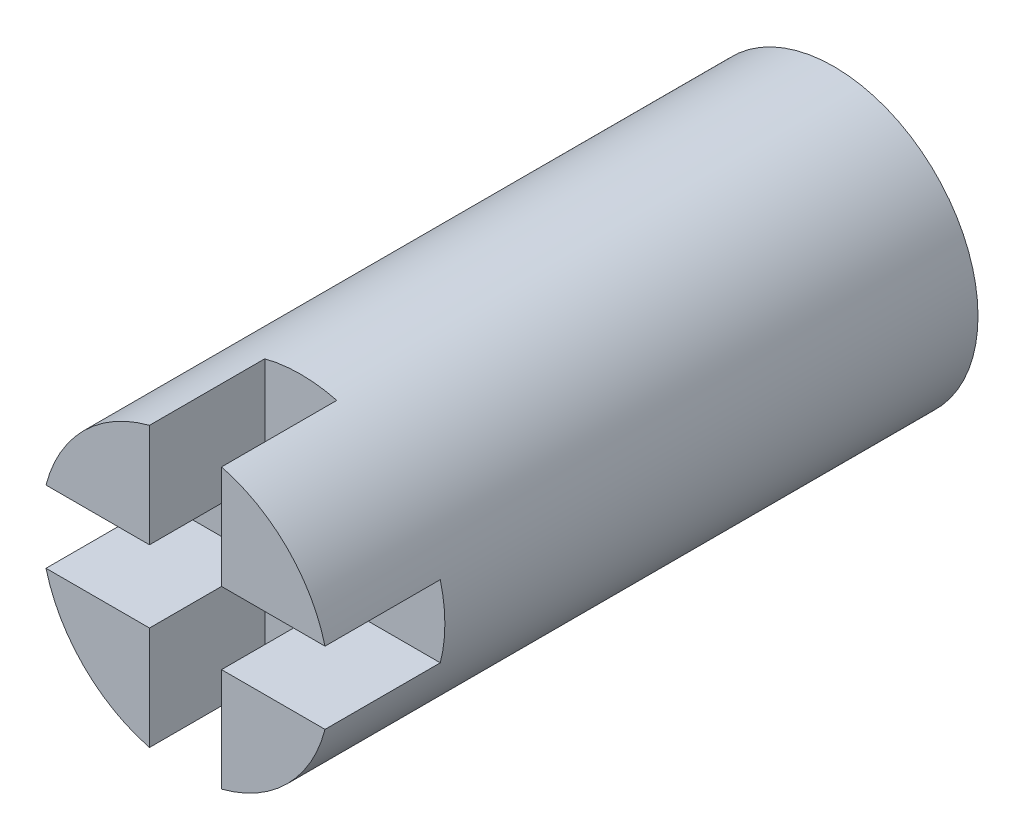
ISO-10303-21;
HEADER;
FILE_DESCRIPTION(('STEP AP214'),'2;1');
FILE_NAME('part.step','',(''),(''),'','','');
FILE_SCHEMA(('AUTOMOTIVE_DESIGN { 1 0 10303 214 1 1 1 1 }'));
ENDSEC;
DATA;
#1=APPLICATION_CONTEXT('core data for automotive mechanical design processes');
#2=APPLICATION_PROTOCOL_DEFINITION('international standard','automotive_design',2000,#1);
#3=PRODUCT_CONTEXT('',#1,'mechanical');
#4=PRODUCT('Part','Part','',(#3));
#5=PRODUCT_RELATED_PRODUCT_CATEGORY('part','',(#4));
#6=PRODUCT_DEFINITION_FORMATION('','',#4);
#7=PRODUCT_DEFINITION_CONTEXT('part definition',#1,'design');
#8=PRODUCT_DEFINITION('design','',#6,#7);
#9=PRODUCT_DEFINITION_SHAPE('','',#8);
#10=(LENGTH_UNIT() NAMED_UNIT(*) SI_UNIT(.MILLI.,.METRE.));
#11=(NAMED_UNIT(*) PLANE_ANGLE_UNIT() SI_UNIT($,.RADIAN.));
#12=(NAMED_UNIT(*) SI_UNIT($,.STERADIAN.) SOLID_ANGLE_UNIT());
#13=UNCERTAINTY_MEASURE_WITH_UNIT(LENGTH_MEASURE(1.E-05),#10,'distance_accuracy_value','');
#14=(GEOMETRIC_REPRESENTATION_CONTEXT(3) GLOBAL_UNCERTAINTY_ASSIGNED_CONTEXT((#13)) GLOBAL_UNIT_ASSIGNED_CONTEXT((#10,
#11,#12)) REPRESENTATION_CONTEXT('',''));
#15=CARTESIAN_POINT('',(0.,0.,0.));
#16=DIRECTION('',(0.,0.,1.));
#17=DIRECTION('',(1.,0.,0.));
#18=AXIS2_PLACEMENT_3D('',#15,#16,#17);
#19=CARTESIAN_POINT('',(0.,0.,28.575));
#20=DIRECTION('',(0.,0.,-1.));
#21=DIRECTION('',(-1.,0.,0.));
#22=AXIS2_PLACEMENT_3D('',#19,#20,#21);
#23=CYLINDRICAL_SURFACE('',#22,6.35);
#24=CARTESIAN_POINT('',(0.,0.,0.));
#25=DIRECTION('',(0.,0.,1.));
#26=DIRECTION('',(1.,0.,0.));
#27=AXIS2_PLACEMENT_3D('',#24,#25,#26);
#28=CIRCLE('',#27,6.35);
#29=CARTESIAN_POINT('',(6.35,0.,0.));
#30=VERTEX_POINT('',#29);
#31=EDGE_CURVE('E42',#30,#30,#28,.T.);
#32=ORIENTED_EDGE('',*,*,#31,.T.);
#33=EDGE_LOOP('',(#32));
#34=FACE_BOUND('',#33,.T.);
#35=DIRECTION('',(0.,0.,1.));
#36=VECTOR('',#35,1.);
#37=CARTESIAN_POINT('',(-1.5875,6.14836106210427,23.495));
#38=LINE('',#37,#36);
#39=CARTESIAN_POINT('',(-1.5875,6.14836106210427,23.495));
#40=VERTEX_POINT('',#39);
#41=CARTESIAN_POINT('',(-1.5875,6.14836106210427,28.575));
#42=VERTEX_POINT('',#41);
#43=EDGE_CURVE('E101',#40,#42,#38,.T.);
#44=ORIENTED_EDGE('',*,*,#43,.F.);
#45=CARTESIAN_POINT('',(0.,0.,23.495));
#46=DIRECTION('',(0.,0.,1.));
#47=DIRECTION('',(1.,0.,0.));
#48=AXIS2_PLACEMENT_3D('',#45,#46,#47);
#49=CIRCLE('',#48,6.35);
#50=CARTESIAN_POINT('',(1.5875,6.14836106210428,23.495));
#51=VERTEX_POINT('',#50);
#52=EDGE_CURVE('E162',#51,#40,#49,.T.);
#53=ORIENTED_EDGE('',*,*,#52,.F.);
#54=DIRECTION('',(0.,0.,1.));
#55=VECTOR('',#54,1.);
#56=CARTESIAN_POINT('',(1.5875,6.14836106210428,23.495));
#57=LINE('',#56,#55);
#58=CARTESIAN_POINT('',(1.5875,6.14836106210428,28.575));
#59=VERTEX_POINT('',#58);
#60=EDGE_CURVE('E145',#51,#59,#57,.T.);
#61=ORIENTED_EDGE('',*,*,#60,.T.);
#62=CARTESIAN_POINT('',(0.,0.,28.575));
#63=DIRECTION('',(0.,0.,1.));
#64=DIRECTION('',(1.,0.,0.));
#65=AXIS2_PLACEMENT_3D('',#62,#63,#64);
#66=CIRCLE('',#65,6.35);
#67=CARTESIAN_POINT('',(6.14836106210427,1.5875,28.575));
#68=VERTEX_POINT('',#67);
#69=EDGE_CURVE('E11',#68,#59,#66,.T.);
#70=ORIENTED_EDGE('',*,*,#69,.F.);
#71=DIRECTION('',(0.,0.,1.));
#72=VECTOR('',#71,1.);
#73=CARTESIAN_POINT('',(6.14836106210427,1.5875,23.495));
#74=LINE('',#73,#72);
#75=CARTESIAN_POINT('',(6.14836106210427,1.5875,23.495));
#76=VERTEX_POINT('',#75);
#77=EDGE_CURVE('E146',#76,#68,#74,.T.);
#78=ORIENTED_EDGE('',*,*,#77,.F.);
#79=CARTESIAN_POINT('',(0.,0.,23.495));
#80=DIRECTION('',(0.,0.,1.));
#81=DIRECTION('',(1.,0.,0.));
#82=AXIS2_PLACEMENT_3D('',#79,#80,#81);
#83=CIRCLE('',#82,6.35);
#84=CARTESIAN_POINT('',(6.14836106210428,-1.5875,23.495));
#85=VERTEX_POINT('',#84);
#86=EDGE_CURVE('E155',#85,#76,#83,.T.);
#87=ORIENTED_EDGE('',*,*,#86,.F.);
#88=DIRECTION('',(0.,0.,1.));
#89=VECTOR('',#88,1.);
#90=CARTESIAN_POINT('',(6.14836106210428,-1.5875,23.495));
#91=LINE('',#90,#89);
#92=CARTESIAN_POINT('',(6.14836106210428,-1.5875,28.575));
#93=VERTEX_POINT('',#92);
#94=EDGE_CURVE('E202',#85,#93,#91,.T.);
#95=ORIENTED_EDGE('',*,*,#94,.T.);
#96=CARTESIAN_POINT('',(1.5875,-6.14836106210428,28.575));
#97=VERTEX_POINT('',#96);
#98=EDGE_CURVE('E49',#97,#93,#66,.T.);
#99=ORIENTED_EDGE('',*,*,#98,.F.);
#100=DIRECTION('',(0.,0.,1.));
#101=VECTOR('',#100,1.);
#102=CARTESIAN_POINT('',(1.5875,-6.14836106210428,23.495));
#103=LINE('',#102,#101);
#104=CARTESIAN_POINT('',(1.5875,-6.14836106210428,23.495));
#105=VERTEX_POINT('',#104);
#106=EDGE_CURVE('E209',#105,#97,#103,.T.);
#107=ORIENTED_EDGE('',*,*,#106,.F.);
#108=CARTESIAN_POINT('',(0.,0.,23.495));
#109=DIRECTION('',(0.,0.,1.));
#110=DIRECTION('',(1.,0.,0.));
#111=AXIS2_PLACEMENT_3D('',#108,#109,#110);
#112=CIRCLE('',#111,6.35);
#113=CARTESIAN_POINT('',(-1.5875,-6.14836106210427,23.495));
#114=VERTEX_POINT('',#113);
#115=EDGE_CURVE('E283',#114,#105,#112,.T.);
#116=ORIENTED_EDGE('',*,*,#115,.F.);
#117=DIRECTION('',(0.,0.,1.));
#118=VECTOR('',#117,1.);
#119=CARTESIAN_POINT('',(-1.5875,-6.14836106210427,23.495));
#120=LINE('',#119,#118);
#121=CARTESIAN_POINT('',(-1.5875,-6.14836106210427,28.575));
#122=VERTEX_POINT('',#121);
#123=EDGE_CURVE('E212',#114,#122,#120,.T.);
#124=ORIENTED_EDGE('',*,*,#123,.T.);
#125=CARTESIAN_POINT('',(-6.14836106210428,-1.5875,28.575));
#126=VERTEX_POINT('',#125);
#127=EDGE_CURVE('E248',#126,#122,#66,.T.);
#128=ORIENTED_EDGE('',*,*,#127,.F.);
#129=DIRECTION('',(0.,0.,1.));
#130=VECTOR('',#129,1.);
#131=CARTESIAN_POINT('',(-6.14836106210428,-1.5875,23.495));
#132=LINE('',#131,#130);
#133=CARTESIAN_POINT('',(-6.14836106210428,-1.5875,23.495));
#134=VERTEX_POINT('',#133);
#135=EDGE_CURVE('E219',#134,#126,#132,.T.);
#136=ORIENTED_EDGE('',*,*,#135,.F.);
#137=CARTESIAN_POINT('',(0.,0.,23.495));
#138=DIRECTION('',(0.,0.,1.));
#139=DIRECTION('',(1.,0.,0.));
#140=AXIS2_PLACEMENT_3D('',#137,#138,#139);
#141=CIRCLE('',#140,6.35);
#142=CARTESIAN_POINT('',(-6.14836106210427,1.5875,23.495));
#143=VERTEX_POINT('',#142);
#144=EDGE_CURVE('E267',#143,#134,#141,.T.);
#145=ORIENTED_EDGE('',*,*,#144,.F.);
#146=DIRECTION('',(0.,0.,1.));
#147=VECTOR('',#146,1.);
#148=CARTESIAN_POINT('',(-6.14836106210427,1.5875,23.495));
#149=LINE('',#148,#147);
#150=CARTESIAN_POINT('',(-6.14836106210427,1.5875,28.575));
#151=VERTEX_POINT('',#150);
#152=EDGE_CURVE('E222',#143,#151,#149,.T.);
#153=ORIENTED_EDGE('',*,*,#152,.T.);
#154=EDGE_CURVE('E48',#42,#151,#66,.T.);
#155=ORIENTED_EDGE('',*,*,#154,.F.);
#156=EDGE_LOOP('',(#44,#53,#61,#70,#78,#87,#95,#99,#107,#116,#124,#128,#136,#145,#153,#155));
#157=FACE_BOUND('',#156,.T.);
#158=ADVANCED_FACE('F39',(#34,#157),#23,.T.);
#159=CARTESIAN_POINT('',(0.,0.,28.575));
#160=DIRECTION('',(0.,0.,1.));
#161=DIRECTION('',(1.,0.,0.));
#162=AXIS2_PLACEMENT_3D('',#159,#160,#161);
#163=PLANE('',#162);
#164=DIRECTION('',(0.,1.,0.));
#165=VECTOR('',#164,1.);
#166=CARTESIAN_POINT('',(1.5875,0.,28.575));
#167=LINE('',#166,#165);
#168=CARTESIAN_POINT('',(1.5875,1.5875,28.575));
#169=VERTEX_POINT('',#168);
#170=EDGE_CURVE('E192',#169,#59,#167,.T.);
#171=ORIENTED_EDGE('',*,*,#170,.F.);
#172=DIRECTION('',(1.,0.,0.));
#173=VECTOR('',#172,1.);
#174=CARTESIAN_POINT('',(0.,1.5875,28.575));
#175=LINE('',#174,#173);
#176=EDGE_CURVE('E140',#169,#68,#175,.T.);
#177=ORIENTED_EDGE('',*,*,#176,.T.);
#178=ORIENTED_EDGE('',*,*,#69,.T.);
#179=EDGE_LOOP('',(#171,#177,#178));
#180=FACE_BOUND('',#179,.T.);
#181=ADVANCED_FACE('F298',(#180),#163,.T.);
#182=ORIENTED_EDGE('',*,*,#127,.T.);
#183=DIRECTION('',(0.,1.,0.));
#184=VECTOR('',#183,1.);
#185=CARTESIAN_POINT('',(-1.5875,0.,28.575));
#186=LINE('',#185,#184);
#187=CARTESIAN_POINT('',(-1.5875,-1.5875,28.575));
#188=VERTEX_POINT('',#187);
#189=EDGE_CURVE('E179',#122,#188,#186,.T.);
#190=ORIENTED_EDGE('',*,*,#189,.T.);
#191=DIRECTION('',(1.,0.,0.));
#192=VECTOR('',#191,1.);
#193=CARTESIAN_POINT('',(0.,-1.5875,28.575));
#194=LINE('',#193,#192);
#195=EDGE_CURVE('E175',#126,#188,#194,.T.);
#196=ORIENTED_EDGE('',*,*,#195,.F.);
#197=EDGE_LOOP('',(#182,#190,#196));
#198=FACE_BOUND('',#197,.T.);
#199=ADVANCED_FACE('F300',(#198),#163,.T.);
#200=DIRECTION('',(1.,0.,0.));
#201=VECTOR('',#200,1.);
#202=CARTESIAN_POINT('',(0.,1.5875,28.575));
#203=LINE('',#202,#201);
#204=CARTESIAN_POINT('',(-1.5875,1.5875,28.575));
#205=VERTEX_POINT('',#204);
#206=EDGE_CURVE('E171',#151,#205,#203,.T.);
#207=ORIENTED_EDGE('',*,*,#206,.T.);
#208=DIRECTION('',(0.,1.,0.));
#209=VECTOR('',#208,1.);
#210=CARTESIAN_POINT('',(-1.5875,0.,28.575));
#211=LINE('',#210,#209);
#212=EDGE_CURVE('E56',#205,#42,#211,.T.);
#213=ORIENTED_EDGE('',*,*,#212,.T.);
#214=ORIENTED_EDGE('',*,*,#154,.T.);
#215=EDGE_LOOP('',(#207,#213,#214));
#216=FACE_BOUND('',#215,.T.);
#217=ADVANCED_FACE('F262',(#216),#163,.T.);
#218=DIRECTION('',(1.,0.,0.));
#219=VECTOR('',#218,1.);
#220=CARTESIAN_POINT('',(0.,-1.5875,28.575));
#221=LINE('',#220,#219);
#222=CARTESIAN_POINT('',(1.5875,-1.5875,28.575));
#223=VERTEX_POINT('',#222);
#224=EDGE_CURVE('E187',#223,#93,#221,.T.);
#225=ORIENTED_EDGE('',*,*,#224,.F.);
#226=DIRECTION('',(0.,1.,0.));
#227=VECTOR('',#226,1.);
#228=CARTESIAN_POINT('',(1.5875,0.,28.575));
#229=LINE('',#228,#227);
#230=EDGE_CURVE('E183',#97,#223,#229,.T.);
#231=ORIENTED_EDGE('',*,*,#230,.F.);
#232=ORIENTED_EDGE('',*,*,#98,.T.);
#233=EDGE_LOOP('',(#225,#231,#232));
#234=FACE_BOUND('',#233,.T.);
#235=ADVANCED_FACE('F241',(#234),#163,.T.);
#236=CARTESIAN_POINT('',(0.,0.,0.));
#237=DIRECTION('',(0.,0.,1.));
#238=DIRECTION('',(1.,0.,0.));
#239=AXIS2_PLACEMENT_3D('',#236,#237,#238);
#240=PLANE('',#239);
#241=CARTESIAN_POINT('',(0.,0.,0.));
#242=DIRECTION('',(0.,0.,-1.));
#243=DIRECTION('',(-1.,0.,0.));
#244=AXIS2_PLACEMENT_3D('',#241,#242,#243);
#245=CIRCLE('',#244,2.9464);
#246=CARTESIAN_POINT('',(-2.9464,0.,0.));
#247=VERTEX_POINT('',#246);
#248=EDGE_CURVE('E197',#247,#247,#245,.T.);
#249=ORIENTED_EDGE('',*,*,#248,.F.);
#250=EDGE_LOOP('',(#249));
#251=FACE_BOUND('',#250,.T.);
#252=ORIENTED_EDGE('',*,*,#31,.F.);
#253=EDGE_LOOP('',(#252));
#254=FACE_BOUND('',#253,.T.);
#255=ADVANCED_FACE('F238',(#251,#254),#240,.F.);
#256=CARTESIAN_POINT('',(0.,0.,12.7));
#257=DIRECTION('',(0.,0.,-1.));
#258=DIRECTION('',(-1.,0.,0.));
#259=AXIS2_PLACEMENT_3D('',#256,#257,#258);
#260=CYLINDRICAL_SURFACE('',#259,2.9464);
#261=CARTESIAN_POINT('',(0.,0.,12.7));
#262=DIRECTION('',(0.,0.,-1.));
#263=DIRECTION('',(-1.,0.,0.));
#264=AXIS2_PLACEMENT_3D('',#261,#262,#263);
#265=CIRCLE('',#264,2.9464);
#266=CARTESIAN_POINT('',(-2.9464,0.,12.7));
#267=VERTEX_POINT('',#266);
#268=EDGE_CURVE('E228',#267,#267,#265,.T.);
#269=ORIENTED_EDGE('',*,*,#268,.F.);
#270=EDGE_LOOP('',(#269));
#271=FACE_BOUND('',#270,.T.);
#272=ORIENTED_EDGE('',*,*,#248,.T.);
#273=EDGE_LOOP('',(#272));
#274=FACE_BOUND('',#273,.T.);
#275=ADVANCED_FACE('F236',(#271,#274),#260,.F.);
#276=CARTESIAN_POINT('',(0.,0.,12.7));
#277=DIRECTION('',(0.,0.,-1.));
#278=DIRECTION('',(-1.,0.,0.));
#279=AXIS2_PLACEMENT_3D('',#276,#277,#278);
#280=PLANE('',#279);
#281=ORIENTED_EDGE('',*,*,#268,.T.);
#282=EDGE_LOOP('',(#281));
#283=FACE_BOUND('',#282,.T.);
#284=ADVANCED_FACE('F335',(#283),#280,.T.);
#285=CARTESIAN_POINT('',(-1.5875,0.,23.495));
#286=DIRECTION('',(1.,0.,0.));
#287=DIRECTION('',(0.,0.,-1.));
#288=AXIS2_PLACEMENT_3D('',#285,#286,#287);
#289=PLANE('',#288);
#290=ORIENTED_EDGE('',*,*,#212,.F.);
#291=DIRECTION('',(0.,0.,1.));
#292=VECTOR('',#291,1.);
#293=CARTESIAN_POINT('',(-1.5875,1.5875,23.495));
#294=LINE('',#293,#292);
#295=CARTESIAN_POINT('',(-1.5875,1.5875,23.495));
#296=VERTEX_POINT('',#295);
#297=EDGE_CURVE('E165',#296,#205,#294,.T.);
#298=ORIENTED_EDGE('',*,*,#297,.F.);
#299=DIRECTION('',(0.,1.,0.));
#300=VECTOR('',#299,1.);
#301=CARTESIAN_POINT('',(-1.5875,0.,23.495));
#302=LINE('',#301,#300);
#303=EDGE_CURVE('E62',#296,#40,#302,.T.);
#304=ORIENTED_EDGE('',*,*,#303,.T.);
#305=ORIENTED_EDGE('',*,*,#43,.T.);
#306=EDGE_LOOP('',(#290,#298,#304,#305));
#307=FACE_BOUND('',#306,.T.);
#308=ADVANCED_FACE('F332',(#307),#289,.T.);
#309=CARTESIAN_POINT('',(1.5875,0.,23.495));
#310=DIRECTION('',(1.,0.,0.));
#311=DIRECTION('',(0.,0.,-1.));
#312=AXIS2_PLACEMENT_3D('',#309,#310,#311);
#313=PLANE('',#312);
#314=ORIENTED_EDGE('',*,*,#170,.T.);
#315=ORIENTED_EDGE('',*,*,#60,.F.);
#316=DIRECTION('',(0.,1.,0.));
#317=VECTOR('',#316,1.);
#318=CARTESIAN_POINT('',(1.5875,0.,23.495));
#319=LINE('',#318,#317);
#320=CARTESIAN_POINT('',(1.5875,1.5875,23.495));
#321=VERTEX_POINT('',#320);
#322=EDGE_CURVE('E151',#321,#51,#319,.T.);
#323=ORIENTED_EDGE('',*,*,#322,.F.);
#324=DIRECTION('',(0.,0.,1.));
#325=VECTOR('',#324,1.);
#326=CARTESIAN_POINT('',(1.5875,1.5875,23.495));
#327=LINE('',#326,#325);
#328=EDGE_CURVE('E134',#321,#169,#327,.T.);
#329=ORIENTED_EDGE('',*,*,#328,.T.);
#330=EDGE_LOOP('',(#314,#315,#323,#329));
#331=FACE_BOUND('',#330,.T.);
#332=ADVANCED_FACE('F159',(#331),#313,.F.);
#333=CARTESIAN_POINT('',(0.,1.5875,23.495));
#334=DIRECTION('',(0.,-1.,0.));
#335=DIRECTION('',(0.,0.,-1.));
#336=AXIS2_PLACEMENT_3D('',#333,#334,#335);
#337=PLANE('',#336);
#338=ORIENTED_EDGE('',*,*,#176,.F.);
#339=ORIENTED_EDGE('',*,*,#328,.F.);
#340=DIRECTION('',(1.,0.,0.));
#341=VECTOR('',#340,1.);
#342=CARTESIAN_POINT('',(0.,1.5875,23.495));
#343=LINE('',#342,#341);
#344=EDGE_CURVE('E137',#321,#76,#343,.T.);
#345=ORIENTED_EDGE('',*,*,#344,.T.);
#346=ORIENTED_EDGE('',*,*,#77,.T.);
#347=EDGE_LOOP('',(#338,#339,#345,#346));
#348=FACE_BOUND('',#347,.T.);
#349=ADVANCED_FACE('F136',(#348),#337,.T.);
#350=CARTESIAN_POINT('',(0.,-1.5875,23.495));
#351=DIRECTION('',(0.,-1.,0.));
#352=DIRECTION('',(0.,0.,-1.));
#353=AXIS2_PLACEMENT_3D('',#350,#351,#352);
#354=PLANE('',#353);
#355=ORIENTED_EDGE('',*,*,#224,.T.);
#356=ORIENTED_EDGE('',*,*,#94,.F.);
#357=DIRECTION('',(1.,0.,0.));
#358=VECTOR('',#357,1.);
#359=CARTESIAN_POINT('',(0.,-1.5875,23.495));
#360=LINE('',#359,#358);
#361=CARTESIAN_POINT('',(1.5875,-1.5875,23.495));
#362=VERTEX_POINT('',#361);
#363=EDGE_CURVE('E291',#362,#85,#360,.T.);
#364=ORIENTED_EDGE('',*,*,#363,.F.);
#365=DIRECTION('',(0.,0.,1.));
#366=VECTOR('',#365,1.);
#367=CARTESIAN_POINT('',(1.5875,-1.5875,23.495));
#368=LINE('',#367,#366);
#369=EDGE_CURVE('E206',#362,#223,#368,.T.);
#370=ORIENTED_EDGE('',*,*,#369,.T.);
#371=EDGE_LOOP('',(#355,#356,#364,#370));
#372=FACE_BOUND('',#371,.T.);
#373=ADVANCED_FACE('F311',(#372),#354,.F.);
#374=CARTESIAN_POINT('',(1.5875,0.,23.495));
#375=DIRECTION('',(1.,0.,0.));
#376=DIRECTION('',(0.,0.,-1.));
#377=AXIS2_PLACEMENT_3D('',#374,#375,#376);
#378=PLANE('',#377);
#379=ORIENTED_EDGE('',*,*,#230,.T.);
#380=ORIENTED_EDGE('',*,*,#369,.F.);
#381=DIRECTION('',(0.,1.,0.));
#382=VECTOR('',#381,1.);
#383=CARTESIAN_POINT('',(1.5875,0.,23.495));
#384=LINE('',#383,#382);
#385=EDGE_CURVE('E287',#105,#362,#384,.T.);
#386=ORIENTED_EDGE('',*,*,#385,.F.);
#387=ORIENTED_EDGE('',*,*,#106,.T.);
#388=EDGE_LOOP('',(#379,#380,#386,#387));
#389=FACE_BOUND('',#388,.T.);
#390=ADVANCED_FACE('F313',(#389),#378,.F.);
#391=CARTESIAN_POINT('',(-1.5875,0.,23.495));
#392=DIRECTION('',(1.,0.,0.));
#393=DIRECTION('',(0.,0.,-1.));
#394=AXIS2_PLACEMENT_3D('',#391,#392,#393);
#395=PLANE('',#394);
#396=ORIENTED_EDGE('',*,*,#189,.F.);
#397=ORIENTED_EDGE('',*,*,#123,.F.);
#398=DIRECTION('',(0.,1.,0.));
#399=VECTOR('',#398,1.);
#400=CARTESIAN_POINT('',(-1.5875,0.,23.495));
#401=LINE('',#400,#399);
#402=CARTESIAN_POINT('',(-1.5875,-1.5875,23.495));
#403=VERTEX_POINT('',#402);
#404=EDGE_CURVE('E280',#114,#403,#401,.T.);
#405=ORIENTED_EDGE('',*,*,#404,.T.);
#406=DIRECTION('',(0.,0.,1.));
#407=VECTOR('',#406,1.);
#408=CARTESIAN_POINT('',(-1.5875,-1.5875,23.495));
#409=LINE('',#408,#407);
#410=EDGE_CURVE('E216',#403,#188,#409,.T.);
#411=ORIENTED_EDGE('',*,*,#410,.T.);
#412=EDGE_LOOP('',(#396,#397,#405,#411));
#413=FACE_BOUND('',#412,.T.);
#414=ADVANCED_FACE('F319',(#413),#395,.T.);
#415=CARTESIAN_POINT('',(0.,-1.5875,23.495));
#416=DIRECTION('',(0.,-1.,0.));
#417=DIRECTION('',(0.,0.,-1.));
#418=AXIS2_PLACEMENT_3D('',#415,#416,#417);
#419=PLANE('',#418);
#420=ORIENTED_EDGE('',*,*,#195,.T.);
#421=ORIENTED_EDGE('',*,*,#410,.F.);
#422=DIRECTION('',(1.,0.,0.));
#423=VECTOR('',#422,1.);
#424=CARTESIAN_POINT('',(0.,-1.5875,23.495));
#425=LINE('',#424,#423);
#426=EDGE_CURVE('E274',#134,#403,#425,.T.);
#427=ORIENTED_EDGE('',*,*,#426,.F.);
#428=ORIENTED_EDGE('',*,*,#135,.T.);
#429=EDGE_LOOP('',(#420,#421,#427,#428));
#430=FACE_BOUND('',#429,.T.);
#431=ADVANCED_FACE('F321',(#430),#419,.F.);
#432=CARTESIAN_POINT('',(0.,1.5875,23.495));
#433=DIRECTION('',(0.,-1.,0.));
#434=DIRECTION('',(0.,0.,-1.));
#435=AXIS2_PLACEMENT_3D('',#432,#433,#434);
#436=PLANE('',#435);
#437=ORIENTED_EDGE('',*,*,#206,.F.);
#438=ORIENTED_EDGE('',*,*,#152,.F.);
#439=DIRECTION('',(1.,0.,0.));
#440=VECTOR('',#439,1.);
#441=CARTESIAN_POINT('',(0.,1.5875,23.495));
#442=LINE('',#441,#440);
#443=EDGE_CURVE('E108',#143,#296,#442,.T.);
#444=ORIENTED_EDGE('',*,*,#443,.T.);
#445=ORIENTED_EDGE('',*,*,#297,.T.);
#446=EDGE_LOOP('',(#437,#438,#444,#445));
#447=FACE_BOUND('',#446,.T.);
#448=ADVANCED_FACE('F268',(#447),#436,.T.);
#449=CARTESIAN_POINT('',(0.,0.,23.495));
#450=DIRECTION('',(0.,0.,1.));
#451=DIRECTION('',(1.,0.,0.));
#452=AXIS2_PLACEMENT_3D('',#449,#450,#451);
#453=PLANE('',#452);
#454=ORIENTED_EDGE('',*,*,#303,.F.);
#455=ORIENTED_EDGE('',*,*,#443,.F.);
#456=ORIENTED_EDGE('',*,*,#144,.T.);
#457=ORIENTED_EDGE('',*,*,#426,.T.);
#458=ORIENTED_EDGE('',*,*,#404,.F.);
#459=ORIENTED_EDGE('',*,*,#115,.T.);
#460=ORIENTED_EDGE('',*,*,#385,.T.);
#461=ORIENTED_EDGE('',*,*,#363,.T.);
#462=ORIENTED_EDGE('',*,*,#86,.T.);
#463=ORIENTED_EDGE('',*,*,#344,.F.);
#464=ORIENTED_EDGE('',*,*,#322,.T.);
#465=ORIENTED_EDGE('',*,*,#52,.T.);
#466=EDGE_LOOP('',(#454,#455,#456,#457,#458,#459,#460,#461,#462,#463,#464,#465));
#467=FACE_BOUND('',#466,.T.);
#468=ADVANCED_FACE('F150',(#467),#453,.T.);
#469=CLOSED_SHELL('',(#158,#181,#199,#217,#235,#255,#275,#284,#308,#332,#349,#373,#390,#414,
#431,#448,#468));
#470=MANIFOLD_SOLID_BREP('B2',#469);
#471=ADVANCED_BREP_SHAPE_REPRESENTATION('',(#18,#470),#14);
#472=SHAPE_DEFINITION_REPRESENTATION(#9,#471);
ENDSEC;
END-ISO-10303-21;
